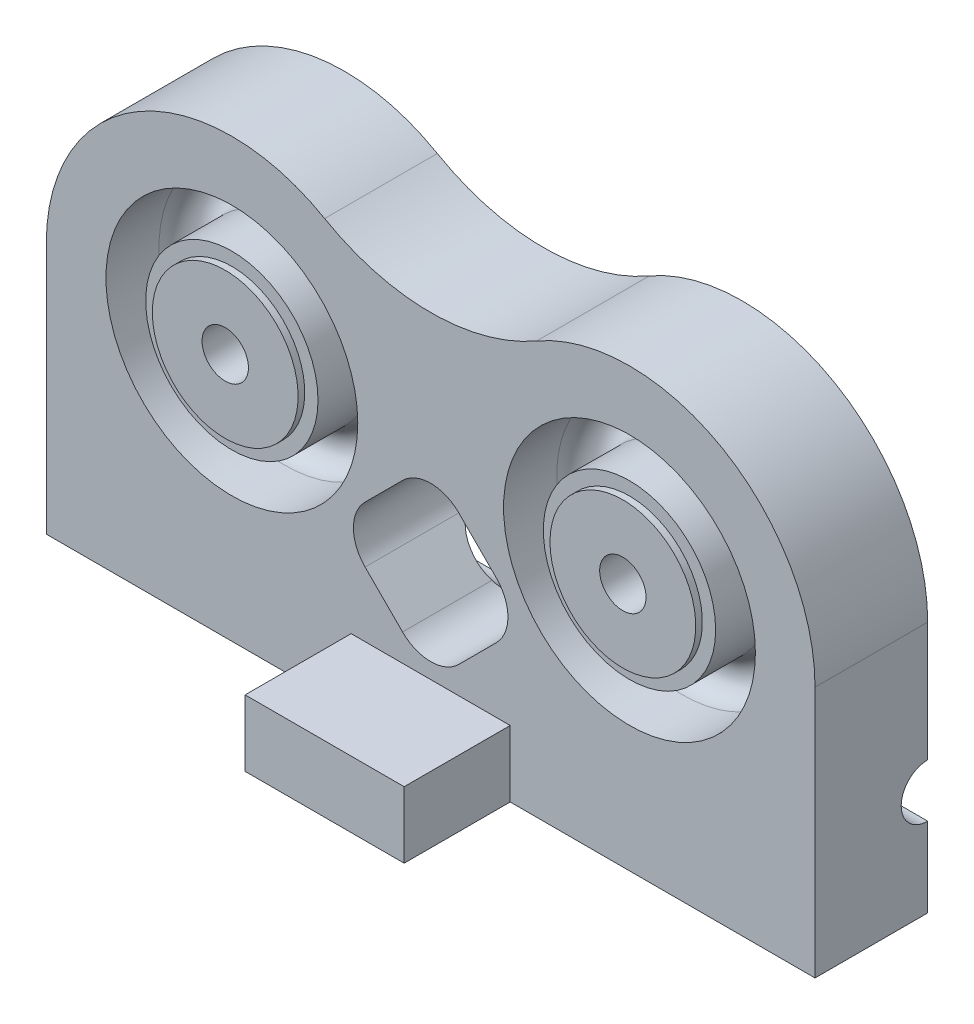
ISO-10303-21;
HEADER;
FILE_DESCRIPTION(('STEP AP214'),'2;1');
FILE_NAME('part.step','',(''),(''),'','','');
FILE_SCHEMA(('AUTOMOTIVE_DESIGN { 1 0 10303 214 1 1 1 1 }'));
ENDSEC;
DATA;
#1=APPLICATION_CONTEXT('core data for automotive mechanical design processes');
#2=APPLICATION_PROTOCOL_DEFINITION('international standard','automotive_design',2000,#1);
#3=PRODUCT_CONTEXT('',#1,'mechanical');
#4=PRODUCT('Part','Part','',(#3));
#5=PRODUCT_RELATED_PRODUCT_CATEGORY('part','',(#4));
#6=PRODUCT_DEFINITION_FORMATION('','',#4);
#7=PRODUCT_DEFINITION_CONTEXT('part definition',#1,'design');
#8=PRODUCT_DEFINITION('design','',#6,#7);
#9=PRODUCT_DEFINITION_SHAPE('','',#8);
#10=(LENGTH_UNIT() NAMED_UNIT(*) SI_UNIT(.MILLI.,.METRE.));
#11=(NAMED_UNIT(*) PLANE_ANGLE_UNIT() SI_UNIT($,.RADIAN.));
#12=(NAMED_UNIT(*) SI_UNIT($,.STERADIAN.) SOLID_ANGLE_UNIT());
#13=UNCERTAINTY_MEASURE_WITH_UNIT(LENGTH_MEASURE(1.E-05),#10,'distance_accuracy_value','');
#14=(GEOMETRIC_REPRESENTATION_CONTEXT(3) GLOBAL_UNCERTAINTY_ASSIGNED_CONTEXT((#13)) GLOBAL_UNIT_ASSIGNED_CONTEXT((#10,
#11,#12)) REPRESENTATION_CONTEXT('',''));
#15=CARTESIAN_POINT('',(0.,0.,0.));
#16=DIRECTION('',(0.,0.,1.));
#17=DIRECTION('',(1.,0.,0.));
#18=AXIS2_PLACEMENT_3D('',#15,#16,#17);
#19=CARTESIAN_POINT('',(30.,0.,8.5));
#20=DIRECTION('',(0.,0.,1.));
#21=DIRECTION('',(1.,0.,0.));
#22=AXIS2_PLACEMENT_3D('',#19,#20,#21);
#23=CYLINDRICAL_SURFACE('',#22,6.5);
#24=CARTESIAN_POINT('',(30.,0.,4.5));
#25=DIRECTION('',(0.,0.,1.));
#26=DIRECTION('',(-1.,0.,0.));
#27=AXIS2_PLACEMENT_3D('',#24,#25,#26);
#28=CIRCLE('',#27,6.50000000000001);
#29=CARTESIAN_POINT('',(23.5,0.,4.5));
#30=VERTEX_POINT('',#29);
#31=EDGE_CURVE('E196',#30,#30,#28,.T.);
#32=ORIENTED_EDGE('',*,*,#31,.T.);
#33=EDGE_LOOP('',(#32));
#34=FACE_BOUND('',#33,.T.);
#35=CARTESIAN_POINT('',(30.,0.,8.5));
#36=DIRECTION('',(0.,0.,1.));
#37=DIRECTION('',(1.,0.,0.));
#38=AXIS2_PLACEMENT_3D('',#35,#36,#37);
#39=CIRCLE('',#38,6.5);
#40=CARTESIAN_POINT('',(36.5,0.,8.5));
#41=VERTEX_POINT('',#40);
#42=EDGE_CURVE('E19',#41,#41,#39,.F.);
#43=ORIENTED_EDGE('',*,*,#42,.T.);
#44=EDGE_LOOP('',(#43));
#45=FACE_BOUND('',#44,.T.);
#46=ADVANCED_FACE('F16',(#34,#45),#23,.T.);
#47=CARTESIAN_POINT('',(0.,0.,8.5));
#48=DIRECTION('',(0.,0.,1.));
#49=DIRECTION('',(1.,0.,0.));
#50=AXIS2_PLACEMENT_3D('',#47,#48,#49);
#51=CYLINDRICAL_SURFACE('',#50,6.5);
#52=CARTESIAN_POINT('',(0.,0.,8.5));
#53=DIRECTION('',(0.,0.,1.));
#54=DIRECTION('',(1.,0.,0.));
#55=AXIS2_PLACEMENT_3D('',#52,#53,#54);
#56=CIRCLE('',#55,6.5);
#57=CARTESIAN_POINT('',(6.5,0.,8.5));
#58=VERTEX_POINT('',#57);
#59=EDGE_CURVE('E193',#58,#58,#56,.F.);
#60=ORIENTED_EDGE('',*,*,#59,.T.);
#61=EDGE_LOOP('',(#60));
#62=FACE_BOUND('',#61,.T.);
#63=CARTESIAN_POINT('',(0.,0.,4.5));
#64=DIRECTION('',(0.,0.,1.));
#65=DIRECTION('',(1.,0.,0.));
#66=AXIS2_PLACEMENT_3D('',#63,#64,#65);
#67=CIRCLE('',#66,6.5);
#68=CARTESIAN_POINT('',(6.5,0.,4.5));
#69=VERTEX_POINT('',#68);
#70=EDGE_CURVE('E344',#69,#69,#67,.T.);
#71=ORIENTED_EDGE('',*,*,#70,.T.);
#72=EDGE_LOOP('',(#71));
#73=FACE_BOUND('',#72,.T.);
#74=ADVANCED_FACE('F203',(#62,#73),#51,.T.);
#75=CARTESIAN_POINT('',(0.,0.,4.5));
#76=DIRECTION('',(0.,0.,1.));
#77=DIRECTION('',(1.,0.,0.));
#78=AXIS2_PLACEMENT_3D('',#75,#76,#77);
#79=TOROIDAL_SURFACE('',#78,8.,1.5);
#80=ORIENTED_EDGE('',*,*,#70,.F.);
#81=EDGE_LOOP('',(#80));
#82=FACE_BOUND('',#81,.T.);
#83=CARTESIAN_POINT('',(0.,0.,4.5));
#84=DIRECTION('',(0.,0.,1.));
#85=DIRECTION('',(1.,0.,0.));
#86=AXIS2_PLACEMENT_3D('',#83,#84,#85);
#87=CIRCLE('',#86,9.5);
#88=CARTESIAN_POINT('',(9.5,0.,4.5));
#89=VERTEX_POINT('',#88);
#90=EDGE_CURVE('E168',#89,#89,#87,.T.);
#91=ORIENTED_EDGE('',*,*,#90,.T.);
#92=EDGE_LOOP('',(#91));
#93=FACE_BOUND('',#92,.T.);
#94=ADVANCED_FACE('F199',(#82,#93),#79,.F.);
#95=CARTESIAN_POINT('',(30.,0.,4.5));
#96=DIRECTION('',(0.,0.,1.));
#97=DIRECTION('',(-1.,0.,0.));
#98=AXIS2_PLACEMENT_3D('',#95,#96,#97);
#99=TOROIDAL_SURFACE('',#98,8.,1.5);
#100=CARTESIAN_POINT('',(30.,0.,4.5));
#101=DIRECTION('',(0.,0.,1.));
#102=DIRECTION('',(1.,0.,0.));
#103=AXIS2_PLACEMENT_3D('',#100,#101,#102);
#104=CIRCLE('',#103,9.5);
#105=CARTESIAN_POINT('',(39.5,0.,4.5));
#106=VERTEX_POINT('',#105);
#107=EDGE_CURVE('E338',#106,#106,#104,.T.);
#108=ORIENTED_EDGE('',*,*,#107,.T.);
#109=EDGE_LOOP('',(#108));
#110=FACE_BOUND('',#109,.T.);
#111=ORIENTED_EDGE('',*,*,#31,.F.);
#112=EDGE_LOOP('',(#111));
#113=FACE_BOUND('',#112,.T.);
#114=ADVANCED_FACE('F202',(#110,#113),#99,.F.);
#115=CARTESIAN_POINT('',(30.,0.,8.5));
#116=DIRECTION('',(0.,0.,-1.));
#117=DIRECTION('',(-1.,0.,0.));
#118=AXIS2_PLACEMENT_3D('',#115,#116,#117);
#119=PLANE('',#118);
#120=ORIENTED_EDGE('',*,*,#42,.F.);
#121=EDGE_LOOP('',(#120));
#122=FACE_BOUND('',#121,.T.);
#123=CARTESIAN_POINT('',(30.,0.,8.5));
#124=DIRECTION('',(0.,0.,-1.));
#125=DIRECTION('',(-1.,0.,0.));
#126=AXIS2_PLACEMENT_3D('',#123,#124,#125);
#127=CIRCLE('',#126,5.5);
#128=CARTESIAN_POINT('',(24.5,0.,8.5));
#129=VERTEX_POINT('',#128);
#130=EDGE_CURVE('E336',#129,#129,#127,.F.);
#131=ORIENTED_EDGE('',*,*,#130,.F.);
#132=EDGE_LOOP('',(#131));
#133=FACE_BOUND('',#132,.T.);
#134=ADVANCED_FACE('F515',(#122,#133),#119,.F.);
#135=CARTESIAN_POINT('',(30.,0.,8.5));
#136=DIRECTION('',(0.,0.,-1.));
#137=DIRECTION('',(-1.,0.,0.));
#138=AXIS2_PLACEMENT_3D('',#135,#136,#137);
#139=PLANE('',#138);
#140=ORIENTED_EDGE('',*,*,#59,.F.);
#141=EDGE_LOOP('',(#140));
#142=FACE_BOUND('',#141,.T.);
#143=CARTESIAN_POINT('',(0.,0.,8.5));
#144=DIRECTION('',(0.,0.,-1.));
#145=DIRECTION('',(-1.,0.,0.));
#146=AXIS2_PLACEMENT_3D('',#143,#144,#145);
#147=CIRCLE('',#146,5.5);
#148=CARTESIAN_POINT('',(-5.5,0.,8.5));
#149=VERTEX_POINT('',#148);
#150=EDGE_CURVE('E332',#149,#149,#147,.F.);
#151=ORIENTED_EDGE('',*,*,#150,.F.);
#152=EDGE_LOOP('',(#151));
#153=FACE_BOUND('',#152,.T.);
#154=ADVANCED_FACE('F513',(#142,#153),#139,.F.);
#155=CARTESIAN_POINT('',(0.,0.,16.5));
#156=DIRECTION('',(0.,0.,-1.));
#157=DIRECTION('',(-1.,0.,0.));
#158=AXIS2_PLACEMENT_3D('',#155,#156,#157);
#159=PLANE('',#158);
#160=DIRECTION('',(-1.,0.,0.));
#161=VECTOR('',#160,1.);
#162=CARTESIAN_POINT('',(44.,-19.,16.5));
#163=LINE('',#162,#161);
#164=CARTESIAN_POINT('',(9.,-19.,16.5));
#165=VERTEX_POINT('',#164);
#166=CARTESIAN_POINT('',(21.,-19.,16.5));
#167=VERTEX_POINT('',#166);
#168=EDGE_CURVE('E163',#165,#167,#163,.F.);
#169=ORIENTED_EDGE('',*,*,#168,.T.);
#170=DIRECTION('',(0.,1.,0.));
#171=VECTOR('',#170,1.);
#172=CARTESIAN_POINT('',(21.,-19.,16.5));
#173=LINE('',#172,#171);
#174=CARTESIAN_POINT('',(21.,-14.,16.5));
#175=VERTEX_POINT('',#174);
#176=EDGE_CURVE('E156',#167,#175,#173,.T.);
#177=ORIENTED_EDGE('',*,*,#176,.T.);
#178=DIRECTION('',(1.,0.,0.));
#179=VECTOR('',#178,1.);
#180=CARTESIAN_POINT('',(9.,-14.,16.5));
#181=LINE('',#180,#179);
#182=CARTESIAN_POINT('',(9.,-14.,16.5));
#183=VERTEX_POINT('',#182);
#184=EDGE_CURVE('E161',#175,#183,#181,.F.);
#185=ORIENTED_EDGE('',*,*,#184,.T.);
#186=DIRECTION('',(0.,1.,0.));
#187=VECTOR('',#186,1.);
#188=CARTESIAN_POINT('',(9.,-19.,16.5));
#189=LINE('',#188,#187);
#190=EDGE_CURVE('E178',#183,#165,#189,.F.);
#191=ORIENTED_EDGE('',*,*,#190,.T.);
#192=EDGE_LOOP('',(#169,#177,#185,#191));
#193=FACE_BOUND('',#192,.T.);
#194=ADVANCED_FACE('F158',(#193),#159,.F.);
#195=CARTESIAN_POINT('',(0.,0.,8.5));
#196=DIRECTION('',(0.,0.,1.));
#197=DIRECTION('',(1.,0.,0.));
#198=AXIS2_PLACEMENT_3D('',#195,#196,#197);
#199=CYLINDRICAL_SURFACE('',#198,9.5);
#200=ORIENTED_EDGE('',*,*,#90,.F.);
#201=EDGE_LOOP('',(#200));
#202=FACE_BOUND('',#201,.T.);
#203=CARTESIAN_POINT('',(0.,0.,8.5));
#204=DIRECTION('',(0.,0.,1.));
#205=DIRECTION('',(1.,0.,0.));
#206=AXIS2_PLACEMENT_3D('',#203,#204,#205);
#207=CIRCLE('',#206,9.5);
#208=CARTESIAN_POINT('',(9.5,0.,8.5));
#209=VERTEX_POINT('',#208);
#210=EDGE_CURVE('E328',#209,#209,#207,.T.);
#211=ORIENTED_EDGE('',*,*,#210,.T.);
#212=EDGE_LOOP('',(#211));
#213=FACE_BOUND('',#212,.T.);
#214=ADVANCED_FACE('F507',(#202,#213),#199,.F.);
#215=CARTESIAN_POINT('',(21.,-19.,16.5));
#216=DIRECTION('',(-1.,0.,0.));
#217=DIRECTION('',(0.,0.,1.));
#218=AXIS2_PLACEMENT_3D('',#215,#216,#217);
#219=PLANE('',#218);
#220=DIRECTION('',(0.,0.,-1.));
#221=VECTOR('',#220,1.);
#222=CARTESIAN_POINT('',(21.,-14.,16.5));
#223=LINE('',#222,#221);
#224=CARTESIAN_POINT('',(21.,-14.,8.5));
#225=VERTEX_POINT('',#224);
#226=EDGE_CURVE('E167',#225,#175,#223,.F.);
#227=ORIENTED_EDGE('',*,*,#226,.T.);
#228=ORIENTED_EDGE('',*,*,#176,.F.);
#229=DIRECTION('',(0.,0.,1.));
#230=VECTOR('',#229,1.);
#231=CARTESIAN_POINT('',(21.,-19.,8.5));
#232=LINE('',#231,#230);
#233=CARTESIAN_POINT('',(21.,-19.,8.5));
#234=VERTEX_POINT('',#233);
#235=EDGE_CURVE('E432',#167,#234,#232,.F.);
#236=ORIENTED_EDGE('',*,*,#235,.T.);
#237=DIRECTION('',(0.,1.,0.));
#238=VECTOR('',#237,1.);
#239=CARTESIAN_POINT('',(21.,0.,8.5));
#240=LINE('',#239,#238);
#241=EDGE_CURVE('E172',#234,#225,#240,.T.);
#242=ORIENTED_EDGE('',*,*,#241,.T.);
#243=EDGE_LOOP('',(#227,#228,#236,#242));
#244=FACE_BOUND('',#243,.T.);
#245=ADVANCED_FACE('F170',(#244),#219,.F.);
#246=CARTESIAN_POINT('',(9.,-14.,16.5));
#247=DIRECTION('',(0.,-1.,0.));
#248=DIRECTION('',(0.,0.,-1.));
#249=AXIS2_PLACEMENT_3D('',#246,#247,#248);
#250=PLANE('',#249);
#251=DIRECTION('',(0.,0.,-1.));
#252=VECTOR('',#251,1.);
#253=CARTESIAN_POINT('',(9.,-14.,16.5));
#254=LINE('',#253,#252);
#255=CARTESIAN_POINT('',(9.,-14.,8.5));
#256=VERTEX_POINT('',#255);
#257=EDGE_CURVE('E175',#256,#183,#254,.F.);
#258=ORIENTED_EDGE('',*,*,#257,.T.);
#259=ORIENTED_EDGE('',*,*,#184,.F.);
#260=ORIENTED_EDGE('',*,*,#226,.F.);
#261=DIRECTION('',(-1.,0.,0.));
#262=VECTOR('',#261,1.);
#263=CARTESIAN_POINT('',(30.,-14.,8.5));
#264=LINE('',#263,#262);
#265=EDGE_CURVE('E140',#225,#256,#264,.T.);
#266=ORIENTED_EDGE('',*,*,#265,.T.);
#267=EDGE_LOOP('',(#258,#259,#260,#266));
#268=FACE_BOUND('',#267,.T.);
#269=ADVANCED_FACE('F174',(#268),#250,.F.);
#270=CARTESIAN_POINT('',(9.,-19.,16.5));
#271=DIRECTION('',(1.,0.,0.));
#272=DIRECTION('',(0.,0.,-1.));
#273=AXIS2_PLACEMENT_3D('',#270,#271,#272);
#274=PLANE('',#273);
#275=DIRECTION('',(0.,0.,1.));
#276=VECTOR('',#275,1.);
#277=CARTESIAN_POINT('',(9.,-19.,8.5));
#278=LINE('',#277,#276);
#279=CARTESIAN_POINT('',(9.,-19.,8.5));
#280=VERTEX_POINT('',#279);
#281=EDGE_CURVE('E335',#280,#165,#278,.T.);
#282=ORIENTED_EDGE('',*,*,#281,.T.);
#283=ORIENTED_EDGE('',*,*,#190,.F.);
#284=ORIENTED_EDGE('',*,*,#257,.F.);
#285=DIRECTION('',(0.,1.,0.));
#286=VECTOR('',#285,1.);
#287=CARTESIAN_POINT('',(9.,0.,8.5));
#288=LINE('',#287,#286);
#289=EDGE_CURVE('E186',#256,#280,#288,.F.);
#290=ORIENTED_EDGE('',*,*,#289,.T.);
#291=EDGE_LOOP('',(#282,#283,#284,#290));
#292=FACE_BOUND('',#291,.T.);
#293=ADVANCED_FACE('F489',(#292),#274,.F.);
#294=CARTESIAN_POINT('',(30.,0.,8.5));
#295=DIRECTION('',(0.,0.,1.));
#296=DIRECTION('',(1.,0.,0.));
#297=AXIS2_PLACEMENT_3D('',#294,#295,#296);
#298=CYLINDRICAL_SURFACE('',#297,9.5);
#299=CARTESIAN_POINT('',(30.,0.,8.5));
#300=DIRECTION('',(0.,0.,1.));
#301=DIRECTION('',(1.,0.,0.));
#302=AXIS2_PLACEMENT_3D('',#299,#300,#301);
#303=CIRCLE('',#302,9.5);
#304=CARTESIAN_POINT('',(39.5,0.,8.5));
#305=VERTEX_POINT('',#304);
#306=EDGE_CURVE('E322',#305,#305,#303,.T.);
#307=ORIENTED_EDGE('',*,*,#306,.T.);
#308=EDGE_LOOP('',(#307));
#309=FACE_BOUND('',#308,.T.);
#310=ORIENTED_EDGE('',*,*,#107,.F.);
#311=EDGE_LOOP('',(#310));
#312=FACE_BOUND('',#311,.T.);
#313=ADVANCED_FACE('F486',(#309,#312),#298,.F.);
#314=CARTESIAN_POINT('',(30.,0.,9.));
#315=DIRECTION('',(0.,0.,-1.));
#316=DIRECTION('',(-1.,0.,0.));
#317=AXIS2_PLACEMENT_3D('',#314,#315,#316);
#318=CYLINDRICAL_SURFACE('',#317,5.5);
#319=CARTESIAN_POINT('',(30.,0.,9.));
#320=DIRECTION('',(0.,0.,-1.));
#321=DIRECTION('',(-1.,0.,0.));
#322=AXIS2_PLACEMENT_3D('',#319,#320,#321);
#323=CIRCLE('',#322,5.5);
#324=CARTESIAN_POINT('',(24.5,0.,9.));
#325=VERTEX_POINT('',#324);
#326=EDGE_CURVE('E318',#325,#325,#323,.F.);
#327=ORIENTED_EDGE('',*,*,#326,.F.);
#328=EDGE_LOOP('',(#327));
#329=FACE_BOUND('',#328,.T.);
#330=ORIENTED_EDGE('',*,*,#130,.T.);
#331=EDGE_LOOP('',(#330));
#332=FACE_BOUND('',#331,.T.);
#333=ADVANCED_FACE('F488',(#329,#332),#318,.T.);
#334=CARTESIAN_POINT('',(0.,0.,9.));
#335=DIRECTION('',(0.,0.,-1.));
#336=DIRECTION('',(-1.,0.,0.));
#337=AXIS2_PLACEMENT_3D('',#334,#335,#336);
#338=CYLINDRICAL_SURFACE('',#337,5.5);
#339=ORIENTED_EDGE('',*,*,#150,.T.);
#340=EDGE_LOOP('',(#339));
#341=FACE_BOUND('',#340,.T.);
#342=CARTESIAN_POINT('',(0.,0.,9.));
#343=DIRECTION('',(0.,0.,-1.));
#344=DIRECTION('',(-1.,0.,0.));
#345=AXIS2_PLACEMENT_3D('',#342,#343,#344);
#346=CIRCLE('',#345,5.5);
#347=CARTESIAN_POINT('',(-5.5,0.,9.));
#348=VERTEX_POINT('',#347);
#349=EDGE_CURVE('E314',#348,#348,#346,.F.);
#350=ORIENTED_EDGE('',*,*,#349,.F.);
#351=EDGE_LOOP('',(#350));
#352=FACE_BOUND('',#351,.T.);
#353=ADVANCED_FACE('F496',(#341,#352),#338,.T.);
#354=CARTESIAN_POINT('',(44.,-19.,8.5));
#355=DIRECTION('',(0.,1.,0.));
#356=DIRECTION('',(-1.,0.,0.));
#357=AXIS2_PLACEMENT_3D('',#354,#355,#356);
#358=PLANE('',#357);
#359=DIRECTION('',(0.,0.,1.));
#360=VECTOR('',#359,1.);
#361=CARTESIAN_POINT('',(44.,-19.,8.5));
#362=LINE('',#361,#360);
#363=CARTESIAN_POINT('',(44.,-19.,0.));
#364=VERTEX_POINT('',#363);
#365=CARTESIAN_POINT('',(44.,-19.,8.5));
#366=VERTEX_POINT('',#365);
#367=EDGE_CURVE('E305',#364,#366,#362,.T.);
#368=ORIENTED_EDGE('',*,*,#367,.T.);
#369=DIRECTION('',(-1.,0.,0.));
#370=VECTOR('',#369,1.);
#371=CARTESIAN_POINT('',(30.,-19.,8.5));
#372=LINE('',#371,#370);
#373=EDGE_CURVE('E442',#366,#234,#372,.T.);
#374=ORIENTED_EDGE('',*,*,#373,.T.);
#375=ORIENTED_EDGE('',*,*,#235,.F.);
#376=ORIENTED_EDGE('',*,*,#168,.F.);
#377=ORIENTED_EDGE('',*,*,#281,.F.);
#378=DIRECTION('',(-1.,0.,0.));
#379=VECTOR('',#378,1.);
#380=CARTESIAN_POINT('',(30.,-19.,8.5));
#381=LINE('',#380,#379);
#382=CARTESIAN_POINT('',(-14.,-19.,8.5));
#383=VERTEX_POINT('',#382);
#384=EDGE_CURVE('E423',#280,#383,#381,.T.);
#385=ORIENTED_EDGE('',*,*,#384,.T.);
#386=DIRECTION('',(0.,0.,1.));
#387=VECTOR('',#386,1.);
#388=CARTESIAN_POINT('',(-14.,-19.,8.5));
#389=LINE('',#388,#387);
#390=CARTESIAN_POINT('',(-14.,-19.,0.));
#391=VERTEX_POINT('',#390);
#392=EDGE_CURVE('E414',#383,#391,#389,.F.);
#393=ORIENTED_EDGE('',*,*,#392,.T.);
#394=DIRECTION('',(-1.,0.,0.));
#395=VECTOR('',#394,1.);
#396=CARTESIAN_POINT('',(30.,-19.,0.));
#397=LINE('',#396,#395);
#398=EDGE_CURVE('E427',#364,#391,#397,.T.);
#399=ORIENTED_EDGE('',*,*,#398,.F.);
#400=EDGE_LOOP('',(#368,#374,#375,#376,#377,#385,#393,#399));
#401=FACE_BOUND('',#400,.T.);
#402=ADVANCED_FACE('F642',(#401),#358,.F.);
#403=CARTESIAN_POINT('',(15.,-9.82842712474619,0.));
#404=DIRECTION('',(0.,0.,1.));
#405=DIRECTION('',(1.,0.,0.));
#406=AXIS2_PLACEMENT_3D('',#403,#404,#405);
#407=CYLINDRICAL_SURFACE('',#406,3.);
#408=CARTESIAN_POINT('',(17.1213203435597,-11.9497474683058,1.76010787920704));
#409=CARTESIAN_POINT('',(17.0657364951601,-12.0053194934549,1.73010596925083));
#410=CARTESIAN_POINT('',(17.0085568996405,-12.0581455977361,1.69821649419696));
#411=CARTESIAN_POINT('',(16.8913484177165,-12.1583948810599,1.63149044396018));
#412=CARTESIAN_POINT('',(16.8313220634925,-12.2058227387051,1.59665646709216));
#413=CARTESIAN_POINT('',(16.6453959782697,-12.341697390015,1.48775730675403));
#414=CARTESIAN_POINT('',(16.5154223930416,-12.4219855215635,1.4102921325031));
#415=CARTESIAN_POINT('',(16.3057187358702,-12.5306888898632,1.28856923563161));
#416=CARTESIAN_POINT('',(16.2292704079919,-12.5663177184849,1.244820777768));
#417=CARTESIAN_POINT('',(16.0729704143261,-12.6312663757916,1.15839705191555));
#418=CARTESIAN_POINT('',(15.9931148530876,-12.660578738096,1.11572310608216));
#419=CARTESIAN_POINT('',(15.8303209872325,-12.7124877389918,1.03425895048089));
#420=CARTESIAN_POINT('',(15.7474187813853,-12.7351450026562,0.9954359606264));
#421=CARTESIAN_POINT('',(15.5771851377141,-12.7736682824071,0.925040381463748));
#422=CARTESIAN_POINT('',(15.4898670537205,-12.7895535471656,0.893447361927938));
#423=CARTESIAN_POINT('',(15.3216176818825,-12.8121834713397,0.846523035060515));
#424=CARTESIAN_POINT('',(15.241271510646,-12.8198288315222,0.82964241833685));
#425=CARTESIAN_POINT('',(15.0788295994646,-12.8284806684117,0.81042997376826));
#426=CARTESIAN_POINT('',(14.9967476199551,-12.8295275934763,0.808009510074155));
#427=CARTESIAN_POINT('',(14.833982515743,-12.8249384842016,0.818298503529452));
#428=CARTESIAN_POINT('',(14.753297131929,-12.8193145189088,0.830980637062353));
#429=CARTESIAN_POINT('',(14.5948571399038,-12.8020261289513,0.867810577032496));
#430=CARTESIAN_POINT('',(14.5171286363521,-12.7903173148941,0.892042531116414));
#431=CARTESIAN_POINT('',(14.3693997982045,-12.7623148503824,0.946110680369577));
#432=CARTESIAN_POINT('',(14.2992079999765,-12.7462945221457,0.975585378773814));
#433=CARTESIAN_POINT('',(14.1616562940912,-12.7097890969417,1.03823835299985));
#434=CARTESIAN_POINT('',(14.0942991673676,-12.6892997321029,1.07142015417858));
#435=CARTESIAN_POINT('',(13.9620286186693,-12.6440092493668,1.13969975144798));
#436=CARTESIAN_POINT('',(13.8971163467454,-12.6192061323668,1.17479843067257));
#437=CARTESIAN_POINT('',(13.7694781850614,-12.56532565156,1.24568857181015));
#438=CARTESIAN_POINT('',(13.706752526076,-12.5362478382819,1.28148010623069));
#439=CARTESIAN_POINT('',(13.5756433482732,-12.4698776304241,1.35731600421602));
#440=CARTESIAN_POINT('',(13.5075324634161,-12.4320127749622,1.39733283267235));
#441=CARTESIAN_POINT('',(13.3739284461896,-12.3507281241129,1.47605420985507));
#442=CARTESIAN_POINT('',(13.3084349169814,-12.3073091750531,1.51475895738078));
#443=CARTESIAN_POINT('',(13.1804239818669,-12.2149215469921,1.58981061213482));
#444=CARTESIAN_POINT('',(13.1178977315144,-12.1659710523789,1.62616466110555));
#445=CARTESIAN_POINT('',(12.9958931510891,-12.0622482743711,1.69573820130763));
#446=CARTESIAN_POINT('',(12.9364179832291,-12.0074701247973,1.72895446930855));
#447=CARTESIAN_POINT('',(12.8786796564404,-11.9497474683058,1.76010787920706));
#448=B_SPLINE_CURVE_WITH_KNOTS('',3,(#408,#409,#410,#411,#412,#413,#414,#415,#416,#417,#418,
#419,#420,#421,#422,#423,#424,#425,#426,#427,#428,#429,#430,#431,#432,#433,#434,#435,#436,#437,
#438,#439,#440,#441,#442,#443,#444,#445,#446,#447),.UNSPECIFIED.,.F.,.F.,(4,2,2,2,2,2,2,2,2,2,2,
2,2,2,2,2,2,2,2,4),(0.,0.252167110117118,0.504113978197275,1.01597428319416,1.30082497348741,
1.58601054673184,1.86851133620764,2.15020370561206,2.3963381478124,2.64096230831662,
2.88514456638014,3.13113368959721,3.36419375179822,3.59747736547213,3.83086937819092,
4.06428594894485,4.32687442106768,4.58942292776264,4.85113215138107,5.1131073525763),.UNSPECIFIED.);
#449=CARTESIAN_POINT('',(17.1213203435597,-11.9497474683058,1.76010787920704));
#450=VERTEX_POINT('',#449);
#451=CARTESIAN_POINT('',(12.8786796564403,-11.9497474683058,1.76010787920704));
#452=VERTEX_POINT('',#451);
#453=EDGE_CURVE('E267',#450,#452,#448,.T.);
#454=ORIENTED_EDGE('',*,*,#453,.T.);
#455=DIRECTION('',(0.,0.,1.));
#456=VECTOR('',#455,1.);
#457=CARTESIAN_POINT('',(12.8786796564403,-11.9497474683058,0.));
#458=LINE('',#457,#456);
#459=CARTESIAN_POINT('',(12.8786796564404,-11.9497474683058,8.5));
#460=VERTEX_POINT('',#459);
#461=EDGE_CURVE('E321',#452,#460,#458,.T.);
#462=ORIENTED_EDGE('',*,*,#461,.T.);
#463=CARTESIAN_POINT('',(15.,-9.82842712474619,8.5));
#464=DIRECTION('',(0.,0.,1.));
#465=DIRECTION('',(1.,0.,0.));
#466=AXIS2_PLACEMENT_3D('',#463,#464,#465);
#467=CIRCLE('',#466,3.);
#468=CARTESIAN_POINT('',(17.1213203435596,-11.9497474683058,8.5));
#469=VERTEX_POINT('',#468);
#470=EDGE_CURVE('E129',#460,#469,#467,.T.);
#471=ORIENTED_EDGE('',*,*,#470,.T.);
#472=DIRECTION('',(0.,0.,1.));
#473=VECTOR('',#472,1.);
#474=CARTESIAN_POINT('',(17.1213203435597,-11.9497474683058,0.));
#475=LINE('',#474,#473);
#476=EDGE_CURVE('E331',#469,#450,#475,.F.);
#477=ORIENTED_EDGE('',*,*,#476,.T.);
#478=EDGE_LOOP('',(#454,#462,#471,#477));
#479=FACE_BOUND('',#478,.T.);
#480=ADVANCED_FACE('F650',(#479),#407,.F.);
#481=CARTESIAN_POINT('',(30.,0.,0.));
#482=DIRECTION('',(0.,0.,-1.));
#483=DIRECTION('',(-1.,0.,0.));
#484=AXIS2_PLACEMENT_3D('',#481,#482,#483);
#485=PLANE('',#484);
#486=ORIENTED_EDGE('',*,*,#398,.T.);
#487=DIRECTION('',(0.,1.,0.));
#488=VECTOR('',#487,1.);
#489=CARTESIAN_POINT('',(-14.,0.,0.));
#490=LINE('',#489,#488);
#491=CARTESIAN_POINT('',(-14.,-13.,0.));
#492=VERTEX_POINT('',#491);
#493=EDGE_CURVE('E412',#391,#492,#490,.T.);
#494=ORIENTED_EDGE('',*,*,#493,.T.);
#495=DIRECTION('',(1.,0.,0.));
#496=VECTOR('',#495,1.);
#497=CARTESIAN_POINT('',(-14.,-13.,0.));
#498=LINE('',#497,#496);
#499=CARTESIAN_POINT('',(44.,-13.,0.));
#500=VERTEX_POINT('',#499);
#501=EDGE_CURVE('E285',#492,#500,#498,.T.);
#502=ORIENTED_EDGE('',*,*,#501,.T.);
#503=DIRECTION('',(0.,-1.,0.));
#504=VECTOR('',#503,1.);
#505=CARTESIAN_POINT('',(44.,0.,0.));
#506=LINE('',#505,#504);
#507=EDGE_CURVE('E299',#500,#364,#506,.T.);
#508=ORIENTED_EDGE('',*,*,#507,.T.);
#509=EDGE_LOOP('',(#486,#494,#502,#508));
#510=FACE_BOUND('',#509,.T.);
#511=ADVANCED_FACE('F659',(#510),#485,.T.);
#512=CARTESIAN_POINT('',(19.9497474683058,-9.12132034355965,0.));
#513=DIRECTION('',(0.707106781186548,-0.707106781186548,0.));
#514=DIRECTION('',(0.707106781186548,0.707106781186548,0.));
#515=AXIS2_PLACEMENT_3D('',#512,#513,#514);
#516=PLANE('',#515);
#517=CARTESIAN_POINT('',(18.0710678118655,-11.,0.));
#518=DIRECTION('',(0.707106781186548,-0.707106781186548,0.));
#519=DIRECTION('',(0.707106781186548,0.707106781186548,0.));
#520=AXIS2_PLACEMENT_3D('',#517,#518,#519);
#521=ELLIPSE('',#520,2.82842712474619,2.);
#522=CARTESIAN_POINT('',(19.9497474683058,-9.12132034355965,0.685975763768061));
#523=VERTEX_POINT('',#522);
#524=EDGE_CURVE('E291',#523,#450,#521,.T.);
#525=ORIENTED_EDGE('',*,*,#524,.T.);
#526=ORIENTED_EDGE('',*,*,#476,.F.);
#527=DIRECTION('',(0.707106781186547,0.707106781186548,0.));
#528=VECTOR('',#527,1.);
#529=CARTESIAN_POINT('',(17.1213203435597,-11.9497474683058,8.5));
#530=LINE('',#529,#528);
#531=CARTESIAN_POINT('',(19.9497474683058,-9.12132034355965,8.5));
#532=VERTEX_POINT('',#531);
#533=EDGE_CURVE('E327',#469,#532,#530,.T.);
#534=ORIENTED_EDGE('',*,*,#533,.T.);
#535=DIRECTION('',(0.,0.,1.));
#536=VECTOR('',#535,1.);
#537=CARTESIAN_POINT('',(19.9497474683058,-9.12132034355966,0.));
#538=LINE('',#537,#536);
#539=EDGE_CURVE('E282',#532,#523,#538,.F.);
#540=ORIENTED_EDGE('',*,*,#539,.T.);
#541=EDGE_LOOP('',(#525,#526,#534,#540));
#542=FACE_BOUND('',#541,.T.);
#543=ADVANCED_FACE('F666',(#542),#516,.F.);
#544=CARTESIAN_POINT('',(30.,0.,8.5));
#545=DIRECTION('',(0.,0.,-1.));
#546=DIRECTION('',(-1.,0.,0.));
#547=AXIS2_PLACEMENT_3D('',#544,#545,#546);
#548=PLANE('',#547);
#549=ORIENTED_EDGE('',*,*,#306,.F.);
#550=EDGE_LOOP('',(#549));
#551=FACE_BOUND('',#550,.T.);
#552=ORIENTED_EDGE('',*,*,#265,.F.);
#553=ORIENTED_EDGE('',*,*,#241,.F.);
#554=ORIENTED_EDGE('',*,*,#373,.F.);
#555=DIRECTION('',(0.,-1.,0.));
#556=VECTOR('',#555,1.);
#557=CARTESIAN_POINT('',(44.,0.,8.5));
#558=LINE('',#557,#556);
#559=CARTESIAN_POINT('',(44.,0.,8.5));
#560=VERTEX_POINT('',#559);
#561=EDGE_CURVE('E406',#366,#560,#558,.F.);
#562=ORIENTED_EDGE('',*,*,#561,.T.);
#563=CARTESIAN_POINT('',(30.,0.,8.5));
#564=DIRECTION('',(0.,0.,-1.));
#565=DIRECTION('',(-1.,0.,0.));
#566=AXIS2_PLACEMENT_3D('',#563,#564,#565);
#567=CIRCLE('',#566,14.);
#568=CARTESIAN_POINT('',(23.,12.1243556529821,8.5));
#569=VERTEX_POINT('',#568);
#570=EDGE_CURVE('E302',#569,#560,#567,.T.);
#571=ORIENTED_EDGE('',*,*,#570,.F.);
#572=CARTESIAN_POINT('',(15.,25.9807621135332,8.5));
#573=DIRECTION('',(0.,0.,-1.));
#574=DIRECTION('',(-1.,0.,0.));
#575=AXIS2_PLACEMENT_3D('',#572,#573,#574);
#576=CIRCLE('',#575,16.);
#577=CARTESIAN_POINT('',(7.,12.1243556529821,8.5));
#578=VERTEX_POINT('',#577);
#579=EDGE_CURVE('E307',#569,#578,#576,.T.);
#580=ORIENTED_EDGE('',*,*,#579,.T.);
#581=CARTESIAN_POINT('',(0.,0.,8.5));
#582=DIRECTION('',(0.,0.,-1.));
#583=DIRECTION('',(-1.,0.,0.));
#584=AXIS2_PLACEMENT_3D('',#581,#582,#583);
#585=CIRCLE('',#584,14.);
#586=CARTESIAN_POINT('',(-14.,0.,8.5));
#587=VERTEX_POINT('',#586);
#588=EDGE_CURVE('E310',#587,#578,#585,.T.);
#589=ORIENTED_EDGE('',*,*,#588,.F.);
#590=DIRECTION('',(0.,1.,0.));
#591=VECTOR('',#590,1.);
#592=CARTESIAN_POINT('',(-14.,0.,8.5));
#593=LINE('',#592,#591);
#594=EDGE_CURVE('E317',#587,#383,#593,.F.);
#595=ORIENTED_EDGE('',*,*,#594,.T.);
#596=ORIENTED_EDGE('',*,*,#384,.F.);
#597=ORIENTED_EDGE('',*,*,#289,.F.);
#598=EDGE_LOOP('',(#552,#553,#554,#562,#571,#580,#589,#595,#596,#597));
#599=FACE_BOUND('',#598,.T.);
#600=CARTESIAN_POINT('',(15.,-4.17157287525381,8.5));
#601=DIRECTION('',(0.,0.,1.));
#602=DIRECTION('',(1.,0.,0.));
#603=AXIS2_PLACEMENT_3D('',#600,#601,#602);
#604=CIRCLE('',#603,3.);
#605=CARTESIAN_POINT('',(12.8786796564403,-2.05025253169417,8.5));
#606=VERTEX_POINT('',#605);
#607=CARTESIAN_POINT('',(17.1213203435596,-2.05025253169417,8.5));
#608=VERTEX_POINT('',#607);
#609=EDGE_CURVE('E392',#606,#608,#604,.F.);
#610=ORIENTED_EDGE('',*,*,#609,.T.);
#611=DIRECTION('',(-0.707106781186547,0.707106781186548,0.));
#612=VECTOR('',#611,1.);
#613=CARTESIAN_POINT('',(17.1213203435597,-2.05025253169418,8.5));
#614=LINE('',#613,#612);
#615=CARTESIAN_POINT('',(19.9497474683058,-4.87867965644035,8.5));
#616=VERTEX_POINT('',#615);
#617=EDGE_CURVE('E395',#608,#616,#614,.F.);
#618=ORIENTED_EDGE('',*,*,#617,.T.);
#619=CARTESIAN_POINT('',(17.8284271247462,-7.,8.5));
#620=DIRECTION('',(0.,0.,1.));
#621=DIRECTION('',(1.,0.,0.));
#622=AXIS2_PLACEMENT_3D('',#619,#620,#621);
#623=CIRCLE('',#622,3.);
#624=EDGE_CURVE('E281',#616,#532,#623,.F.);
#625=ORIENTED_EDGE('',*,*,#624,.T.);
#626=ORIENTED_EDGE('',*,*,#533,.F.);
#627=ORIENTED_EDGE('',*,*,#470,.F.);
#628=DIRECTION('',(0.707106781186548,-0.707106781186548,0.));
#629=VECTOR('',#628,1.);
#630=CARTESIAN_POINT('',(12.8786796564403,-11.9497474683058,8.5));
#631=LINE('',#630,#629);
#632=CARTESIAN_POINT('',(10.0502525316942,-9.12132034355965,8.5));
#633=VERTEX_POINT('',#632);
#634=EDGE_CURVE('E325',#460,#633,#631,.F.);
#635=ORIENTED_EDGE('',*,*,#634,.T.);
#636=CARTESIAN_POINT('',(12.1715728752538,-7.,8.5));
#637=DIRECTION('',(0.,0.,1.));
#638=DIRECTION('',(1.,0.,0.));
#639=AXIS2_PLACEMENT_3D('',#636,#637,#638);
#640=CIRCLE('',#639,3.);
#641=CARTESIAN_POINT('',(10.0502525316942,-4.87867965644035,8.5));
#642=VERTEX_POINT('',#641);
#643=EDGE_CURVE('E251',#633,#642,#640,.F.);
#644=ORIENTED_EDGE('',*,*,#643,.T.);
#645=DIRECTION('',(-0.707106781186548,-0.707106781186548,0.));
#646=VECTOR('',#645,1.);
#647=CARTESIAN_POINT('',(10.0502525316942,-4.87867965644034,8.5));
#648=LINE('',#647,#646);
#649=EDGE_CURVE('E391',#642,#606,#648,.F.);
#650=ORIENTED_EDGE('',*,*,#649,.T.);
#651=EDGE_LOOP('',(#610,#618,#625,#626,#627,#635,#644,#650));
#652=FACE_BOUND('',#651,.T.);
#653=ORIENTED_EDGE('',*,*,#210,.F.);
#654=EDGE_LOOP('',(#653));
#655=FACE_BOUND('',#654,.T.);
#656=ADVANCED_FACE('F675',(#551,#599,#652,#655),#548,.F.);
#657=CARTESIAN_POINT('',(12.8786796564403,-11.9497474683058,0.));
#658=DIRECTION('',(-0.707106781186548,-0.707106781186548,0.));
#659=DIRECTION('',(0.707106781186548,-0.707106781186548,0.));
#660=AXIS2_PLACEMENT_3D('',#657,#658,#659);
#661=PLANE('',#660);
#662=CARTESIAN_POINT('',(11.9289321881345,-11.,0.));
#663=DIRECTION('',(-0.707106781186548,-0.707106781186548,0.));
#664=DIRECTION('',(0.707106781186548,-0.707106781186548,0.));
#665=AXIS2_PLACEMENT_3D('',#662,#663,#664);
#666=ELLIPSE('',#665,2.82842712474619,2.);
#667=CARTESIAN_POINT('',(10.0502525316942,-9.12132034355965,0.685975763768053));
#668=VERTEX_POINT('',#667);
#669=EDGE_CURVE('E286',#452,#668,#666,.T.);
#670=ORIENTED_EDGE('',*,*,#669,.T.);
#671=DIRECTION('',(0.,0.,1.));
#672=VECTOR('',#671,1.);
#673=CARTESIAN_POINT('',(10.0502525316942,-9.12132034355965,0.));
#674=LINE('',#673,#672);
#675=EDGE_CURVE('E248',#668,#633,#674,.T.);
#676=ORIENTED_EDGE('',*,*,#675,.T.);
#677=ORIENTED_EDGE('',*,*,#634,.F.);
#678=ORIENTED_EDGE('',*,*,#461,.F.);
#679=EDGE_LOOP('',(#670,#676,#677,#678));
#680=FACE_BOUND('',#679,.T.);
#681=ADVANCED_FACE('F683',(#680),#661,.F.);
#682=CARTESIAN_POINT('',(30.,0.,9.));
#683=DIRECTION('',(0.,0.,1.));
#684=DIRECTION('',(1.,0.,0.));
#685=AXIS2_PLACEMENT_3D('',#682,#683,#684);
#686=PLANE('',#685);
#687=CARTESIAN_POINT('',(30.,0.,9.));
#688=DIRECTION('',(0.,0.,1.));
#689=DIRECTION('',(1.,0.,0.));
#690=AXIS2_PLACEMENT_3D('',#687,#688,#689);
#691=CIRCLE('',#690,1.75);
#692=CARTESIAN_POINT('',(31.75,0.,9.));
#693=VERTEX_POINT('',#692);
#694=EDGE_CURVE('E249',#693,#693,#691,.F.);
#695=ORIENTED_EDGE('',*,*,#694,.T.);
#696=EDGE_LOOP('',(#695));
#697=FACE_BOUND('',#696,.T.);
#698=ORIENTED_EDGE('',*,*,#326,.T.);
#699=EDGE_LOOP('',(#698));
#700=FACE_BOUND('',#699,.T.);
#701=ADVANCED_FACE('F692',(#697,#700),#686,.T.);
#702=CARTESIAN_POINT('',(0.,0.,9.));
#703=DIRECTION('',(0.,0.,1.));
#704=DIRECTION('',(1.,0.,0.));
#705=AXIS2_PLACEMENT_3D('',#702,#703,#704);
#706=PLANE('',#705);
#707=ORIENTED_EDGE('',*,*,#349,.T.);
#708=EDGE_LOOP('',(#707));
#709=FACE_BOUND('',#708,.T.);
#710=CARTESIAN_POINT('',(0.,0.,9.));
#711=DIRECTION('',(0.,0.,1.));
#712=DIRECTION('',(1.,0.,0.));
#713=AXIS2_PLACEMENT_3D('',#710,#711,#712);
#714=CIRCLE('',#713,1.75);
#715=CARTESIAN_POINT('',(1.75,0.,9.));
#716=VERTEX_POINT('',#715);
#717=EDGE_CURVE('E372',#716,#716,#714,.F.);
#718=ORIENTED_EDGE('',*,*,#717,.T.);
#719=EDGE_LOOP('',(#718));
#720=FACE_BOUND('',#719,.T.);
#721=ADVANCED_FACE('F700',(#709,#720),#706,.T.);
#722=CARTESIAN_POINT('',(-14.,0.,8.5));
#723=DIRECTION('',(1.,0.,0.));
#724=DIRECTION('',(0.,1.,0.));
#725=AXIS2_PLACEMENT_3D('',#722,#723,#724);
#726=PLANE('',#725);
#727=CARTESIAN_POINT('',(-14.,-11.,0.));
#728=DIRECTION('',(1.,0.,0.));
#729=DIRECTION('',(0.,1.,0.));
#730=AXIS2_PLACEMENT_3D('',#727,#728,#729);
#731=CIRCLE('',#730,2.);
#732=CARTESIAN_POINT('',(-14.,-9.00000000000001,0.));
#733=VERTEX_POINT('',#732);
#734=EDGE_CURVE('E283',#733,#492,#731,.T.);
#735=ORIENTED_EDGE('',*,*,#734,.T.);
#736=ORIENTED_EDGE('',*,*,#493,.F.);
#737=ORIENTED_EDGE('',*,*,#392,.F.);
#738=ORIENTED_EDGE('',*,*,#594,.F.);
#739=DIRECTION('',(0.,0.,-1.));
#740=VECTOR('',#739,1.);
#741=CARTESIAN_POINT('',(-14.,0.,8.5));
#742=LINE('',#741,#740);
#743=CARTESIAN_POINT('',(-14.,0.,0.));
#744=VERTEX_POINT('',#743);
#745=EDGE_CURVE('E313',#744,#587,#742,.F.);
#746=ORIENTED_EDGE('',*,*,#745,.F.);
#747=DIRECTION('',(0.,1.,0.));
#748=VECTOR('',#747,1.);
#749=CARTESIAN_POINT('',(-14.,0.,0.));
#750=LINE('',#749,#748);
#751=EDGE_CURVE('E371',#733,#744,#750,.T.);
#752=ORIENTED_EDGE('',*,*,#751,.F.);
#753=EDGE_LOOP('',(#735,#736,#737,#738,#746,#752));
#754=FACE_BOUND('',#753,.T.);
#755=ADVANCED_FACE('F708',(#754),#726,.F.);
#756=CARTESIAN_POINT('',(0.,0.,8.5));
#757=DIRECTION('',(0.,0.,-1.));
#758=DIRECTION('',(-1.,0.,0.));
#759=AXIS2_PLACEMENT_3D('',#756,#757,#758);
#760=CYLINDRICAL_SURFACE('',#759,14.);
#761=ORIENTED_EDGE('',*,*,#588,.T.);
#762=DIRECTION('',(0.,0.,-1.));
#763=VECTOR('',#762,1.);
#764=CARTESIAN_POINT('',(7.00000000000001,12.1243556529821,8.5));
#765=LINE('',#764,#763);
#766=CARTESIAN_POINT('',(7.,12.1243556529821,0.));
#767=VERTEX_POINT('',#766);
#768=EDGE_CURVE('E309',#578,#767,#765,.T.);
#769=ORIENTED_EDGE('',*,*,#768,.T.);
#770=CARTESIAN_POINT('',(0.,0.,0.));
#771=DIRECTION('',(0.,0.,-1.));
#772=DIRECTION('',(-1.,0.,0.));
#773=AXIS2_PLACEMENT_3D('',#770,#771,#772);
#774=CIRCLE('',#773,14.);
#775=EDGE_CURVE('E369',#744,#767,#774,.T.);
#776=ORIENTED_EDGE('',*,*,#775,.F.);
#777=ORIENTED_EDGE('',*,*,#745,.T.);
#778=EDGE_LOOP('',(#761,#769,#776,#777));
#779=FACE_BOUND('',#778,.T.);
#780=ADVANCED_FACE('F717',(#779),#760,.T.);
#781=CARTESIAN_POINT('',(15.,25.9807621135332,8.5));
#782=DIRECTION('',(0.,0.,-1.));
#783=DIRECTION('',(-1.,0.,0.));
#784=AXIS2_PLACEMENT_3D('',#781,#782,#783);
#785=CYLINDRICAL_SURFACE('',#784,16.);
#786=ORIENTED_EDGE('',*,*,#768,.F.);
#787=ORIENTED_EDGE('',*,*,#579,.F.);
#788=DIRECTION('',(0.,0.,-1.));
#789=VECTOR('',#788,1.);
#790=CARTESIAN_POINT('',(23.,12.1243556529821,8.5));
#791=LINE('',#790,#789);
#792=CARTESIAN_POINT('',(23.,12.1243556529821,0.));
#793=VERTEX_POINT('',#792);
#794=EDGE_CURVE('E306',#793,#569,#791,.F.);
#795=ORIENTED_EDGE('',*,*,#794,.F.);
#796=CARTESIAN_POINT('',(15.,25.9807621135332,0.));
#797=DIRECTION('',(0.,0.,-1.));
#798=DIRECTION('',(-1.,0.,0.));
#799=AXIS2_PLACEMENT_3D('',#796,#797,#798);
#800=CIRCLE('',#799,16.);
#801=EDGE_CURVE('E366',#767,#793,#800,.F.);
#802=ORIENTED_EDGE('',*,*,#801,.F.);
#803=EDGE_LOOP('',(#786,#787,#795,#802));
#804=FACE_BOUND('',#803,.T.);
#805=ADVANCED_FACE('F726',(#804),#785,.F.);
#806=CARTESIAN_POINT('',(30.,0.,8.5));
#807=DIRECTION('',(0.,0.,-1.));
#808=DIRECTION('',(-1.,0.,0.));
#809=AXIS2_PLACEMENT_3D('',#806,#807,#808);
#810=CYLINDRICAL_SURFACE('',#809,14.);
#811=ORIENTED_EDGE('',*,*,#570,.T.);
#812=DIRECTION('',(0.,0.,1.));
#813=VECTOR('',#812,1.);
#814=CARTESIAN_POINT('',(44.,0.,8.5));
#815=LINE('',#814,#813);
#816=CARTESIAN_POINT('',(44.,0.,0.));
#817=VERTEX_POINT('',#816);
#818=EDGE_CURVE('E402',#560,#817,#815,.F.);
#819=ORIENTED_EDGE('',*,*,#818,.T.);
#820=CARTESIAN_POINT('',(30.,0.,0.));
#821=DIRECTION('',(0.,0.,-1.));
#822=DIRECTION('',(-1.,0.,0.));
#823=AXIS2_PLACEMENT_3D('',#820,#821,#822);
#824=CIRCLE('',#823,14.);
#825=EDGE_CURVE('E362',#793,#817,#824,.T.);
#826=ORIENTED_EDGE('',*,*,#825,.F.);
#827=ORIENTED_EDGE('',*,*,#794,.T.);
#828=EDGE_LOOP('',(#811,#819,#826,#827));
#829=FACE_BOUND('',#828,.T.);
#830=ADVANCED_FACE('F735',(#829),#810,.T.);
#831=CARTESIAN_POINT('',(44.,0.,8.5));
#832=DIRECTION('',(-1.,0.,0.));
#833=DIRECTION('',(0.,-1.,0.));
#834=AXIS2_PLACEMENT_3D('',#831,#832,#833);
#835=PLANE('',#834);
#836=CARTESIAN_POINT('',(44.,-11.,0.));
#837=DIRECTION('',(1.,0.,0.));
#838=DIRECTION('',(0.,1.,0.));
#839=AXIS2_PLACEMENT_3D('',#836,#837,#838);
#840=CIRCLE('',#839,2.);
#841=CARTESIAN_POINT('',(44.,-8.99999999999999,0.));
#842=VERTEX_POINT('',#841);
#843=EDGE_CURVE('E295',#500,#842,#840,.F.);
#844=ORIENTED_EDGE('',*,*,#843,.T.);
#845=DIRECTION('',(0.,1.,0.));
#846=VECTOR('',#845,1.);
#847=CARTESIAN_POINT('',(44.,0.,0.));
#848=LINE('',#847,#846);
#849=EDGE_CURVE('E365',#817,#842,#848,.F.);
#850=ORIENTED_EDGE('',*,*,#849,.F.);
#851=ORIENTED_EDGE('',*,*,#818,.F.);
#852=ORIENTED_EDGE('',*,*,#561,.F.);
#853=ORIENTED_EDGE('',*,*,#367,.F.);
#854=ORIENTED_EDGE('',*,*,#507,.F.);
#855=EDGE_LOOP('',(#844,#850,#851,#852,#853,#854));
#856=FACE_BOUND('',#855,.T.);
#857=ADVANCED_FACE('F259',(#856),#835,.F.);
#858=CARTESIAN_POINT('',(-14.,-11.,0.));
#859=DIRECTION('',(1.,0.,0.));
#860=DIRECTION('',(0.,1.,0.));
#861=AXIS2_PLACEMENT_3D('',#858,#859,#860);
#862=CYLINDRICAL_SURFACE('',#861,2.);
#863=ORIENTED_EDGE('',*,*,#734,.F.);
#864=DIRECTION('',(-1.,0.,0.));
#865=VECTOR('',#864,1.);
#866=CARTESIAN_POINT('',(30.,-9.00000000000001,0.));
#867=LINE('',#866,#865);
#868=CARTESIAN_POINT('',(9.93550489775403,-9.00000000000001,0.));
#869=VERTEX_POINT('',#868);
#870=EDGE_CURVE('E374',#869,#733,#867,.T.);
#871=ORIENTED_EDGE('',*,*,#870,.F.);
#872=CARTESIAN_POINT('',(9.93550489775403,-9.00000000000001,0.));
#873=CARTESIAN_POINT('',(9.93550672116543,-8.99999161643275,0.0424325825614132));
#874=CARTESIAN_POINT('',(9.93671270456857,-9.001350039735,0.0848650519179498));
#875=CARTESIAN_POINT('',(9.94154790277496,-9.00674185989428,0.169437349823914));
#876=CARTESIAN_POINT('',(9.94517804551005,-9.0107762810792,0.211577060066044));
#877=CARTESIAN_POINT('',(9.95478124423816,-9.02135643227184,0.294416797315141));
#878=CARTESIAN_POINT('',(9.96070687942893,-9.02785127782126,0.335128844669888));
#879=CARTESIAN_POINT('',(9.97492111718475,-9.0432403755294,0.415656880262966));
#880=CARTESIAN_POINT('',(9.98320849036856,-9.05213337921963,0.455473323096083));
#881=CARTESIAN_POINT('',(10.0005767945459,-9.07048492153055,0.527358073588798));
#882=CARTESIAN_POINT('',(10.0092906438527,-9.07959759203988,0.559604507109894));
#883=CARTESIAN_POINT('',(10.0284608373954,-9.09934726918149,0.623416106293726));
#884=CARTESIAN_POINT('',(10.0389310885372,-9.10999633826608,0.654973362068895));
#885=CARTESIAN_POINT('',(10.0502525316942,-9.12132034355965,0.685975763768054));
#886=B_SPLINE_CURVE_WITH_KNOTS('',3,(#872,#873,#874,#875,#876,#877,#878,#879,#880,#881,#882,
#883,#884,#885),.UNSPECIFIED.,.F.,.F.,(4,2,2,2,2,2,4),(0.,0.127259085231805,0.254566911277356,
0.379374118008414,0.504116475780597,0.607906958413805,0.71256179273435),.UNSPECIFIED.);
#887=EDGE_CURVE('E240',#869,#668,#886,.T.);
#888=ORIENTED_EDGE('',*,*,#887,.T.);
#889=ORIENTED_EDGE('',*,*,#669,.F.);
#890=ORIENTED_EDGE('',*,*,#453,.F.);
#891=ORIENTED_EDGE('',*,*,#524,.F.);
#892=CARTESIAN_POINT('',(19.9497474683058,-9.12132034355965,0.685975763768057));
#893=CARTESIAN_POINT('',(19.9635161033479,-9.10754544885566,0.648276476380066));
#894=CARTESIAN_POINT('',(19.9760257213022,-9.09477349446661,0.609750225181623));
#895=CARTESIAN_POINT('',(19.998552462616,-9.07143101829707,0.531307246730491));
#896=CARTESIAN_POINT('',(20.0085685184815,-9.0608614396682,0.491389932271202));
#897=CARTESIAN_POINT('',(20.0259491062346,-9.04231580504513,0.411257827519701));
#898=CARTESIAN_POINT('',(20.0333619690982,-9.03429277491998,0.371064374997482));
#899=CARTESIAN_POINT('',(20.0458270871771,-9.02069857623921,0.289924854683282));
#900=CARTESIAN_POINT('',(20.0508806005364,-9.01512610099591,0.248979200145534));
#901=CARTESIAN_POINT('',(20.057999574363,-9.00724456660283,0.173529276531565));
#902=CARTESIAN_POINT('',(20.0604244365896,-9.00454448878481,0.139098727425303));
#903=CARTESIAN_POINT('',(20.0636783974197,-9.00091303943639,0.0697806185777192));
#904=CARTESIAN_POINT('',(20.0644940144605,-8.99999661141262,0.0348916425087667));
#905=CARTESIAN_POINT('',(20.064495102246,-9.,0.));
#906=B_SPLINE_CURVE_WITH_KNOTS('',3,(#892,#893,#894,#895,#896,#897,#898,#899,#900,#901,#902,
#903,#904,#905),.UNSPECIFIED.,.F.,.F.,(4,2,2,2,2,2,4),(0.,0.127262351241909,0.254579090171078,
0.379388643544346,0.504131564889485,0.607913881238902,0.712562010504745),.UNSPECIFIED.);
#907=CARTESIAN_POINT('',(20.064495102246,-9.,0.));
#908=VERTEX_POINT('',#907);
#909=EDGE_CURVE('E275',#523,#908,#906,.T.);
#910=ORIENTED_EDGE('',*,*,#909,.T.);
#911=DIRECTION('',(-1.,0.,0.));
#912=VECTOR('',#911,1.);
#913=CARTESIAN_POINT('',(30.,-8.99999999999999,0.));
#914=LINE('',#913,#912);
#915=EDGE_CURVE('E361',#842,#908,#914,.T.);
#916=ORIENTED_EDGE('',*,*,#915,.F.);
#917=ORIENTED_EDGE('',*,*,#843,.F.);
#918=ORIENTED_EDGE('',*,*,#501,.F.);
#919=EDGE_LOOP('',(#863,#871,#888,#889,#890,#891,#910,#916,#917,#918));
#920=FACE_BOUND('',#919,.T.);
#921=ADVANCED_FACE('F253',(#920),#862,.F.);
#922=CARTESIAN_POINT('',(17.8284271247462,-7.,0.));
#923=DIRECTION('',(0.,0.,1.));
#924=DIRECTION('',(1.,0.,0.));
#925=AXIS2_PLACEMENT_3D('',#922,#923,#924);
#926=CYLINDRICAL_SURFACE('',#925,3.);
#927=DIRECTION('',(0.,0.,1.));
#928=VECTOR('',#927,1.);
#929=CARTESIAN_POINT('',(19.9497474683058,-4.87867965644034,0.));
#930=LINE('',#929,#928);
#931=CARTESIAN_POINT('',(19.9497474683058,-4.87867965644035,0.));
#932=VERTEX_POINT('',#931);
#933=EDGE_CURVE('E396',#616,#932,#930,.F.);
#934=ORIENTED_EDGE('',*,*,#933,.T.);
#935=CARTESIAN_POINT('',(17.8284271247462,-7.,0.));
#936=DIRECTION('',(0.,0.,1.));
#937=DIRECTION('',(1.,0.,0.));
#938=AXIS2_PLACEMENT_3D('',#935,#936,#937);
#939=CIRCLE('',#938,3.);
#940=EDGE_CURVE('E359',#908,#932,#939,.T.);
#941=ORIENTED_EDGE('',*,*,#940,.F.);
#942=ORIENTED_EDGE('',*,*,#909,.F.);
#943=ORIENTED_EDGE('',*,*,#539,.F.);
#944=ORIENTED_EDGE('',*,*,#624,.F.);
#945=EDGE_LOOP('',(#934,#941,#942,#943,#944));
#946=FACE_BOUND('',#945,.T.);
#947=ADVANCED_FACE('F258',(#946),#926,.F.);
#948=CARTESIAN_POINT('',(17.1213203435597,-2.05025253169418,0.));
#949=DIRECTION('',(0.707106781186548,0.707106781186547,0.));
#950=DIRECTION('',(-0.707106781186547,0.707106781186548,0.));
#951=AXIS2_PLACEMENT_3D('',#948,#949,#950);
#952=PLANE('',#951);
#953=DIRECTION('',(0.,0.,1.));
#954=VECTOR('',#953,1.);
#955=CARTESIAN_POINT('',(17.1213203435597,-2.05025253169418,0.));
#956=LINE('',#955,#954);
#957=CARTESIAN_POINT('',(17.1213203435596,-2.05025253169417,0.));
#958=VERTEX_POINT('',#957);
#959=EDGE_CURVE('E393',#608,#958,#956,.F.);
#960=ORIENTED_EDGE('',*,*,#959,.T.);
#961=DIRECTION('',(-0.707106781186547,0.707106781186548,0.));
#962=VECTOR('',#961,1.);
#963=CARTESIAN_POINT('',(19.9497474683058,-4.87867965644034,0.));
#964=LINE('',#963,#962);
#965=EDGE_CURVE('E358',#932,#958,#964,.T.);
#966=ORIENTED_EDGE('',*,*,#965,.F.);
#967=ORIENTED_EDGE('',*,*,#933,.F.);
#968=ORIENTED_EDGE('',*,*,#617,.F.);
#969=EDGE_LOOP('',(#960,#966,#967,#968));
#970=FACE_BOUND('',#969,.T.);
#971=ADVANCED_FACE('F763',(#970),#952,.F.);
#972=CARTESIAN_POINT('',(15.,-4.17157287525381,0.));
#973=DIRECTION('',(0.,0.,1.));
#974=DIRECTION('',(1.,0.,0.));
#975=AXIS2_PLACEMENT_3D('',#972,#973,#974);
#976=CYLINDRICAL_SURFACE('',#975,3.);
#977=DIRECTION('',(0.,0.,1.));
#978=VECTOR('',#977,1.);
#979=CARTESIAN_POINT('',(12.8786796564403,-2.05025253169418,0.));
#980=LINE('',#979,#978);
#981=CARTESIAN_POINT('',(12.8786796564403,-2.05025253169417,0.));
#982=VERTEX_POINT('',#981);
#983=EDGE_CURVE('E389',#606,#982,#980,.F.);
#984=ORIENTED_EDGE('',*,*,#983,.T.);
#985=CARTESIAN_POINT('',(15.,-4.17157287525381,0.));
#986=DIRECTION('',(0.,0.,1.));
#987=DIRECTION('',(1.,0.,0.));
#988=AXIS2_PLACEMENT_3D('',#985,#986,#987);
#989=CIRCLE('',#988,3.);
#990=EDGE_CURVE('E355',#958,#982,#989,.T.);
#991=ORIENTED_EDGE('',*,*,#990,.F.);
#992=ORIENTED_EDGE('',*,*,#959,.F.);
#993=ORIENTED_EDGE('',*,*,#609,.F.);
#994=EDGE_LOOP('',(#984,#991,#992,#993));
#995=FACE_BOUND('',#994,.T.);
#996=ADVANCED_FACE('F771',(#995),#976,.F.);
#997=CARTESIAN_POINT('',(10.0502525316942,-4.87867965644034,0.));
#998=DIRECTION('',(-0.707106781186548,0.707106781186548,0.));
#999=DIRECTION('',(-0.707106781186548,-0.707106781186548,0.));
#1000=AXIS2_PLACEMENT_3D('',#997,#998,#999);
#1001=PLANE('',#1000);
#1002=DIRECTION('',(0.,0.,1.));
#1003=VECTOR('',#1002,1.);
#1004=CARTESIAN_POINT('',(10.0502525316942,-4.87867965644034,0.));
#1005=LINE('',#1004,#1003);
#1006=CARTESIAN_POINT('',(10.0502525316942,-4.87867965644035,0.));
#1007=VERTEX_POINT('',#1006);
#1008=EDGE_CURVE('E34',#642,#1007,#1005,.F.);
#1009=ORIENTED_EDGE('',*,*,#1008,.T.);
#1010=DIRECTION('',(-0.707106781186548,-0.707106781186547,0.));
#1011=VECTOR('',#1010,1.);
#1012=CARTESIAN_POINT('',(12.8786796564403,-2.05025253169418,0.));
#1013=LINE('',#1012,#1011);
#1014=EDGE_CURVE('E354',#982,#1007,#1013,.T.);
#1015=ORIENTED_EDGE('',*,*,#1014,.F.);
#1016=ORIENTED_EDGE('',*,*,#983,.F.);
#1017=ORIENTED_EDGE('',*,*,#649,.F.);
#1018=EDGE_LOOP('',(#1009,#1015,#1016,#1017));
#1019=FACE_BOUND('',#1018,.T.);
#1020=ADVANCED_FACE('F236',(#1019),#1001,.F.);
#1021=CARTESIAN_POINT('',(12.1715728752538,-7.,0.));
#1022=DIRECTION('',(0.,0.,1.));
#1023=DIRECTION('',(1.,0.,0.));
#1024=AXIS2_PLACEMENT_3D('',#1021,#1022,#1023);
#1025=CYLINDRICAL_SURFACE('',#1024,3.);
#1026=ORIENTED_EDGE('',*,*,#887,.F.);
#1027=CARTESIAN_POINT('',(12.1715728752538,-7.,0.));
#1028=DIRECTION('',(0.,0.,1.));
#1029=DIRECTION('',(1.,0.,0.));
#1030=AXIS2_PLACEMENT_3D('',#1027,#1028,#1029);
#1031=CIRCLE('',#1030,3.);
#1032=EDGE_CURVE('E351',#1007,#869,#1031,.T.);
#1033=ORIENTED_EDGE('',*,*,#1032,.F.);
#1034=ORIENTED_EDGE('',*,*,#1008,.F.);
#1035=ORIENTED_EDGE('',*,*,#643,.F.);
#1036=ORIENTED_EDGE('',*,*,#675,.F.);
#1037=EDGE_LOOP('',(#1026,#1033,#1034,#1035,#1036));
#1038=FACE_BOUND('',#1037,.T.);
#1039=ADVANCED_FACE('F231',(#1038),#1025,.F.);
#1040=CARTESIAN_POINT('',(30.,0.,0.));
#1041=DIRECTION('',(0.,0.,1.));
#1042=DIRECTION('',(1.,0.,0.));
#1043=AXIS2_PLACEMENT_3D('',#1040,#1041,#1042);
#1044=CYLINDRICAL_SURFACE('',#1043,1.75);
#1045=CARTESIAN_POINT('',(30.,0.,0.));
#1046=DIRECTION('',(0.,0.,1.));
#1047=DIRECTION('',(1.,0.,0.));
#1048=AXIS2_PLACEMENT_3D('',#1045,#1046,#1047);
#1049=CIRCLE('',#1048,1.75);
#1050=CARTESIAN_POINT('',(31.75,0.,0.));
#1051=VERTEX_POINT('',#1050);
#1052=EDGE_CURVE('E25',#1051,#1051,#1049,.T.);
#1053=ORIENTED_EDGE('',*,*,#1052,.F.);
#1054=EDGE_LOOP('',(#1053));
#1055=FACE_BOUND('',#1054,.T.);
#1056=ORIENTED_EDGE('',*,*,#694,.F.);
#1057=EDGE_LOOP('',(#1056));
#1058=FACE_BOUND('',#1057,.T.);
#1059=ADVANCED_FACE('F224',(#1055,#1058),#1044,.F.);
#1060=CARTESIAN_POINT('',(0.,0.,0.));
#1061=DIRECTION('',(0.,0.,1.));
#1062=DIRECTION('',(1.,0.,0.));
#1063=AXIS2_PLACEMENT_3D('',#1060,#1061,#1062);
#1064=CYLINDRICAL_SURFACE('',#1063,1.75);
#1065=ORIENTED_EDGE('',*,*,#717,.F.);
#1066=EDGE_LOOP('',(#1065));
#1067=FACE_BOUND('',#1066,.T.);
#1068=CARTESIAN_POINT('',(0.,0.,0.));
#1069=DIRECTION('',(0.,0.,1.));
#1070=DIRECTION('',(1.,0.,0.));
#1071=AXIS2_PLACEMENT_3D('',#1068,#1069,#1070);
#1072=CIRCLE('',#1071,1.75);
#1073=CARTESIAN_POINT('',(1.75,0.,0.));
#1074=VERTEX_POINT('',#1073);
#1075=EDGE_CURVE('E11',#1074,#1074,#1072,.T.);
#1076=ORIENTED_EDGE('',*,*,#1075,.F.);
#1077=EDGE_LOOP('',(#1076));
#1078=FACE_BOUND('',#1077,.T.);
#1079=ADVANCED_FACE('F218',(#1067,#1078),#1064,.F.);
#1080=CARTESIAN_POINT('',(30.,0.,0.));
#1081=DIRECTION('',(0.,0.,-1.));
#1082=DIRECTION('',(-1.,0.,0.));
#1083=AXIS2_PLACEMENT_3D('',#1080,#1081,#1082);
#1084=PLANE('',#1083);
#1085=ORIENTED_EDGE('',*,*,#1075,.T.);
#1086=EDGE_LOOP('',(#1085));
#1087=FACE_BOUND('',#1086,.T.);
#1088=ORIENTED_EDGE('',*,*,#1052,.T.);
#1089=EDGE_LOOP('',(#1088));
#1090=FACE_BOUND('',#1089,.T.);
#1091=ORIENTED_EDGE('',*,*,#1014,.T.);
#1092=ORIENTED_EDGE('',*,*,#1032,.T.);
#1093=ORIENTED_EDGE('',*,*,#870,.T.);
#1094=ORIENTED_EDGE('',*,*,#751,.T.);
#1095=ORIENTED_EDGE('',*,*,#775,.T.);
#1096=ORIENTED_EDGE('',*,*,#801,.T.);
#1097=ORIENTED_EDGE('',*,*,#825,.T.);
#1098=ORIENTED_EDGE('',*,*,#849,.T.);
#1099=ORIENTED_EDGE('',*,*,#915,.T.);
#1100=ORIENTED_EDGE('',*,*,#940,.T.);
#1101=ORIENTED_EDGE('',*,*,#965,.T.);
#1102=ORIENTED_EDGE('',*,*,#990,.T.);
#1103=EDGE_LOOP('',(#1091,#1092,#1093,#1094,#1095,#1096,#1097,#1098,#1099,#1100,#1101,#1102));
#1104=FACE_BOUND('',#1103,.T.);
#1105=ADVANCED_FACE('F216',(#1087,#1090,#1104),#1084,.T.);
#1106=CLOSED_SHELL('',(#46,#74,#94,#114,#134,#154,#194,#214,#245,#269,#293,#313,#333,#353,#402,
#480,#511,#543,#656,#681,#701,#721,#755,#780,#805,#830,#857,#921,#947,#971,#996,#1020,#1039,
#1059,#1079,#1105));
#1107=MANIFOLD_SOLID_BREP('B1',#1106);
#1108=ADVANCED_BREP_SHAPE_REPRESENTATION('',(#18,#1107),#14);
#1109=SHAPE_DEFINITION_REPRESENTATION(#9,#1108);
ENDSEC;
END-ISO-10303-21;
